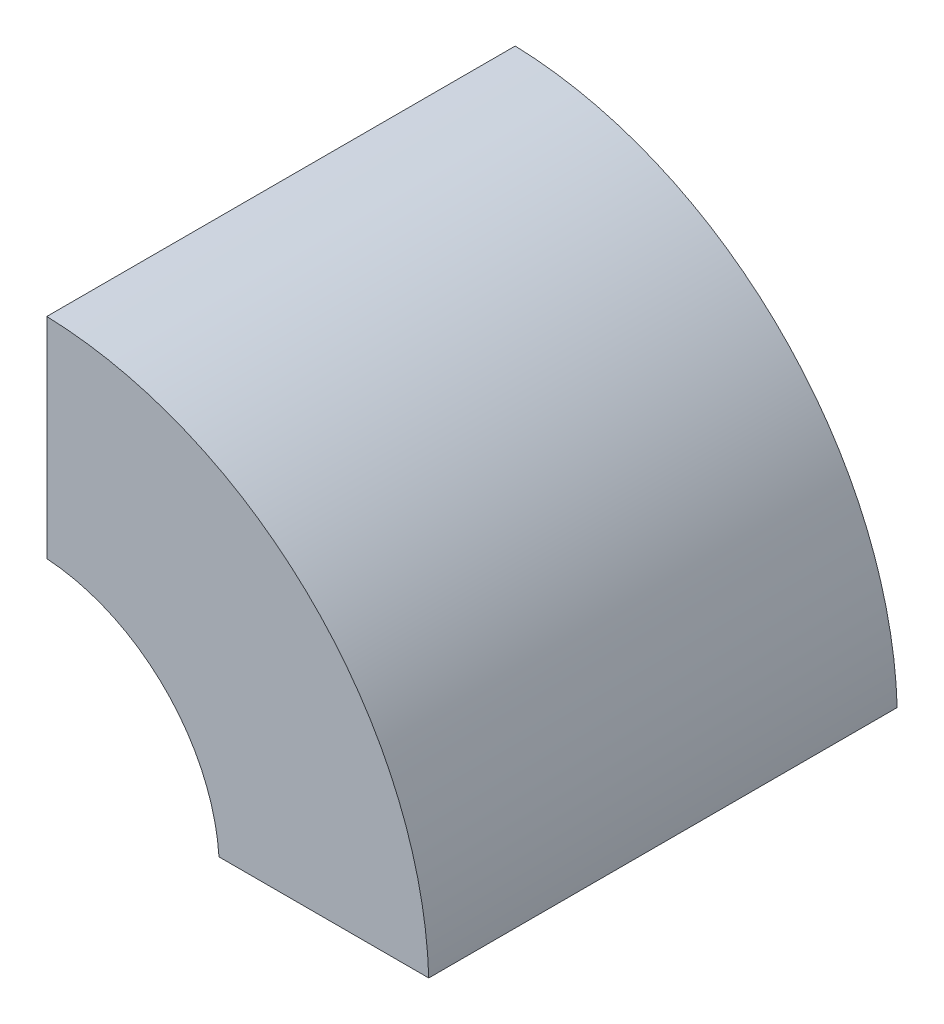
ISO-10303-21;
HEADER;
FILE_DESCRIPTION(('STEP AP214'),'2;1');
FILE_NAME('part.step','',(''),(''),'','','');
FILE_SCHEMA(('AUTOMOTIVE_DESIGN { 1 0 10303 214 1 1 1 1 }'));
ENDSEC;
DATA;
#1=APPLICATION_CONTEXT('core data for automotive mechanical design processes');
#2=APPLICATION_PROTOCOL_DEFINITION('international standard','automotive_design',2000,#1);
#3=PRODUCT_CONTEXT('',#1,'mechanical');
#4=PRODUCT('Part','Part','',(#3));
#5=PRODUCT_RELATED_PRODUCT_CATEGORY('part','',(#4));
#6=PRODUCT_DEFINITION_FORMATION('','',#4);
#7=PRODUCT_DEFINITION_CONTEXT('part definition',#1,'design');
#8=PRODUCT_DEFINITION('design','',#6,#7);
#9=PRODUCT_DEFINITION_SHAPE('','',#8);
#10=(LENGTH_UNIT() NAMED_UNIT(*) SI_UNIT(.MILLI.,.METRE.));
#11=(NAMED_UNIT(*) PLANE_ANGLE_UNIT() SI_UNIT($,.RADIAN.));
#12=(NAMED_UNIT(*) SI_UNIT($,.STERADIAN.) SOLID_ANGLE_UNIT());
#13=UNCERTAINTY_MEASURE_WITH_UNIT(LENGTH_MEASURE(1.E-05),#10,'distance_accuracy_value','');
#14=(GEOMETRIC_REPRESENTATION_CONTEXT(3) GLOBAL_UNCERTAINTY_ASSIGNED_CONTEXT((#13)) GLOBAL_UNIT_ASSIGNED_CONTEXT((#10,
#11,#12)) REPRESENTATION_CONTEXT('',''));
#15=CARTESIAN_POINT('',(0.,0.,0.));
#16=DIRECTION('',(0.,0.,1.));
#17=DIRECTION('',(1.,0.,0.));
#18=AXIS2_PLACEMENT_3D('',#15,#16,#17);
#19=CARTESIAN_POINT('',(0.,0.,-19.));
#20=DIRECTION('',(0.,0.,1.));
#21=DIRECTION('',(1.,0.,0.));
#22=AXIS2_PLACEMENT_3D('',#19,#20,#21);
#23=CYLINDRICAL_SURFACE('',#22,16.);
#24=CARTESIAN_POINT('',(0.,0.,0.));
#25=DIRECTION('',(0.,0.,1.));
#26=DIRECTION('',(1.,0.,0.));
#27=AXIS2_PLACEMENT_3D('',#24,#25,#26);
#28=CIRCLE('',#27,16.);
#29=CARTESIAN_POINT('',(15.9921855917195,0.500000000000029,0.));
#30=VERTEX_POINT('',#29);
#31=CARTESIAN_POINT('',(0.499999999999972,15.9921855917195,0.));
#32=VERTEX_POINT('',#31);
#33=EDGE_CURVE('E111',#30,#32,#28,.T.);
#34=ORIENTED_EDGE('',*,*,#33,.F.);
#35=DIRECTION('',(0.,0.,1.));
#36=VECTOR('',#35,1.);
#37=CARTESIAN_POINT('',(15.9921855917195,0.500000000000029,-19.));
#38=LINE('',#37,#36);
#39=CARTESIAN_POINT('',(15.9921855917195,0.500000000000029,-19.));
#40=VERTEX_POINT('',#39);
#41=EDGE_CURVE('E11',#40,#30,#38,.T.);
#42=ORIENTED_EDGE('',*,*,#41,.F.);
#43=CARTESIAN_POINT('',(0.,0.,-19.));
#44=DIRECTION('',(0.,0.,1.));
#45=DIRECTION('',(1.,0.,0.));
#46=AXIS2_PLACEMENT_3D('',#43,#44,#45);
#47=CIRCLE('',#46,16.);
#48=CARTESIAN_POINT('',(0.499999999999972,15.9921855917195,-19.));
#49=VERTEX_POINT('',#48);
#50=EDGE_CURVE('E103',#40,#49,#47,.T.);
#51=ORIENTED_EDGE('',*,*,#50,.T.);
#52=DIRECTION('',(0.,0.,1.));
#53=VECTOR('',#52,1.);
#54=CARTESIAN_POINT('',(0.499999999999972,15.9921855917195,-19.));
#55=LINE('',#54,#53);
#56=EDGE_CURVE('E44',#49,#32,#55,.T.);
#57=ORIENTED_EDGE('',*,*,#56,.T.);
#58=EDGE_LOOP('',(#34,#42,#51,#57));
#59=FACE_BOUND('',#58,.T.);
#60=ADVANCED_FACE('F41',(#59),#23,.T.);
#61=CARTESIAN_POINT('',(7.48331477354788,0.500000000000028,-19.));
#62=DIRECTION('',(0.,-1.,0.));
#63=DIRECTION('',(1.,0.,0.));
#64=AXIS2_PLACEMENT_3D('',#61,#62,#63);
#65=PLANE('',#64);
#66=DIRECTION('',(1.,0.,0.));
#67=VECTOR('',#66,1.);
#68=CARTESIAN_POINT('',(7.48331477354788,0.500000000000028,0.));
#69=LINE('',#68,#67);
#70=CARTESIAN_POINT('',(7.48331477354788,0.500000000000028,0.));
#71=VERTEX_POINT('',#70);
#72=EDGE_CURVE('E106',#71,#30,#69,.T.);
#73=ORIENTED_EDGE('',*,*,#72,.F.);
#74=DIRECTION('',(0.,0.,1.));
#75=VECTOR('',#74,1.);
#76=CARTESIAN_POINT('',(7.48331477354788,0.500000000000028,-19.));
#77=LINE('',#76,#75);
#78=CARTESIAN_POINT('',(7.48331477354788,0.500000000000028,-19.));
#79=VERTEX_POINT('',#78);
#80=EDGE_CURVE('E51',#79,#71,#77,.T.);
#81=ORIENTED_EDGE('',*,*,#80,.F.);
#82=DIRECTION('',(1.,0.,0.));
#83=VECTOR('',#82,1.);
#84=CARTESIAN_POINT('',(7.48331477354788,0.500000000000028,-19.));
#85=LINE('',#84,#83);
#86=EDGE_CURVE('E98',#79,#40,#85,.T.);
#87=ORIENTED_EDGE('',*,*,#86,.T.);
#88=ORIENTED_EDGE('',*,*,#41,.T.);
#89=EDGE_LOOP('',(#73,#81,#87,#88));
#90=FACE_BOUND('',#89,.T.);
#91=ADVANCED_FACE('F127',(#90),#65,.T.);
#92=CARTESIAN_POINT('',(0.,0.,-19.));
#93=DIRECTION('',(0.,0.,1.));
#94=DIRECTION('',(1.,0.,0.));
#95=AXIS2_PLACEMENT_3D('',#92,#93,#94);
#96=CYLINDRICAL_SURFACE('',#95,7.5);
#97=CARTESIAN_POINT('',(0.,0.,0.));
#98=DIRECTION('',(0.,0.,-1.));
#99=DIRECTION('',(1.,0.,0.));
#100=AXIS2_PLACEMENT_3D('',#97,#98,#99);
#101=CIRCLE('',#100,7.5);
#102=CARTESIAN_POINT('',(0.499999999999973,7.48331477354788,0.));
#103=VERTEX_POINT('',#102);
#104=EDGE_CURVE('E92',#103,#71,#101,.T.);
#105=ORIENTED_EDGE('',*,*,#104,.F.);
#106=DIRECTION('',(0.,0.,1.));
#107=VECTOR('',#106,1.);
#108=CARTESIAN_POINT('',(0.499999999999973,7.48331477354788,-19.));
#109=LINE('',#108,#107);
#110=CARTESIAN_POINT('',(0.499999999999973,7.48331477354788,-19.));
#111=VERTEX_POINT('',#110);
#112=EDGE_CURVE('E87',#111,#103,#109,.T.);
#113=ORIENTED_EDGE('',*,*,#112,.F.);
#114=CARTESIAN_POINT('',(0.,0.,-19.));
#115=DIRECTION('',(0.,0.,-1.));
#116=DIRECTION('',(1.,0.,0.));
#117=AXIS2_PLACEMENT_3D('',#114,#115,#116);
#118=CIRCLE('',#117,7.5);
#119=EDGE_CURVE('E90',#111,#79,#118,.T.);
#120=ORIENTED_EDGE('',*,*,#119,.T.);
#121=ORIENTED_EDGE('',*,*,#80,.T.);
#122=EDGE_LOOP('',(#105,#113,#120,#121));
#123=FACE_BOUND('',#122,.T.);
#124=ADVANCED_FACE('F89',(#123),#96,.F.);
#125=CARTESIAN_POINT('',(0.499999999999972,15.9921855917195,-19.));
#126=DIRECTION('',(-1.,0.,0.));
#127=DIRECTION('',(0.,-1.,0.));
#128=AXIS2_PLACEMENT_3D('',#125,#126,#127);
#129=PLANE('',#128);
#130=DIRECTION('',(0.,-1.,0.));
#131=VECTOR('',#130,1.);
#132=CARTESIAN_POINT('',(0.499999999999972,15.9921855917195,0.));
#133=LINE('',#132,#131);
#134=EDGE_CURVE('E115',#32,#103,#133,.T.);
#135=ORIENTED_EDGE('',*,*,#134,.F.);
#136=ORIENTED_EDGE('',*,*,#56,.F.);
#137=DIRECTION('',(0.,-1.,0.));
#138=VECTOR('',#137,1.);
#139=CARTESIAN_POINT('',(0.499999999999972,15.9921855917195,-19.));
#140=LINE('',#139,#138);
#141=EDGE_CURVE('E97',#49,#111,#140,.T.);
#142=ORIENTED_EDGE('',*,*,#141,.T.);
#143=ORIENTED_EDGE('',*,*,#112,.T.);
#144=EDGE_LOOP('',(#135,#136,#142,#143));
#145=FACE_BOUND('',#144,.T.);
#146=ADVANCED_FACE('F101',(#145),#129,.T.);
#147=CARTESIAN_POINT('',(0.,0.,-19.));
#148=DIRECTION('',(0.,0.,1.));
#149=DIRECTION('',(1.,0.,0.));
#150=AXIS2_PLACEMENT_3D('',#147,#148,#149);
#151=PLANE('',#150);
#152=ORIENTED_EDGE('',*,*,#50,.F.);
#153=ORIENTED_EDGE('',*,*,#86,.F.);
#154=ORIENTED_EDGE('',*,*,#119,.F.);
#155=ORIENTED_EDGE('',*,*,#141,.F.);
#156=EDGE_LOOP('',(#152,#153,#154,#155));
#157=FACE_BOUND('',#156,.T.);
#158=ADVANCED_FACE('F96',(#157),#151,.F.);
#159=CARTESIAN_POINT('',(0.,0.,0.));
#160=DIRECTION('',(0.,0.,1.));
#161=DIRECTION('',(1.,0.,0.));
#162=AXIS2_PLACEMENT_3D('',#159,#160,#161);
#163=PLANE('',#162);
#164=ORIENTED_EDGE('',*,*,#33,.T.);
#165=ORIENTED_EDGE('',*,*,#134,.T.);
#166=ORIENTED_EDGE('',*,*,#104,.T.);
#167=ORIENTED_EDGE('',*,*,#72,.T.);
#168=EDGE_LOOP('',(#164,#165,#166,#167));
#169=FACE_BOUND('',#168,.T.);
#170=ADVANCED_FACE('F126',(#169),#163,.T.);
#171=CLOSED_SHELL('',(#60,#91,#124,#146,#158,#170));
#172=MANIFOLD_SOLID_BREP('B2',#171);
#173=ADVANCED_BREP_SHAPE_REPRESENTATION('',(#18,#172),#14);
#174=SHAPE_DEFINITION_REPRESENTATION(#9,#173);
ENDSEC;
END-ISO-10303-21;
